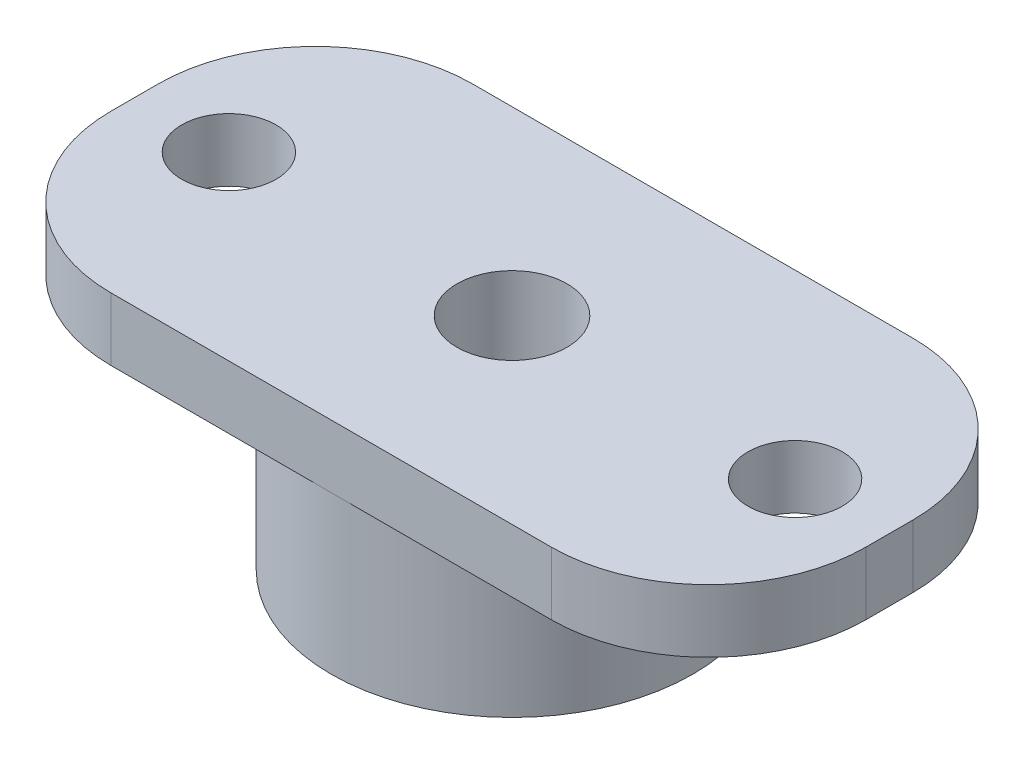
ISO-10303-21;
HEADER;
FILE_DESCRIPTION(('STEP AP214'),'2;1');
FILE_NAME('part.step','',(''),(''),'','','');
FILE_SCHEMA(('AUTOMOTIVE_DESIGN { 1 0 10303 214 1 1 1 1 }'));
ENDSEC;
DATA;
#1=APPLICATION_CONTEXT('core data for automotive mechanical design processes');
#2=APPLICATION_PROTOCOL_DEFINITION('international standard','automotive_design',2000,#1);
#3=PRODUCT_CONTEXT('',#1,'mechanical');
#4=PRODUCT('Part','Part','',(#3));
#5=PRODUCT_RELATED_PRODUCT_CATEGORY('part','',(#4));
#6=PRODUCT_DEFINITION_FORMATION('','',#4);
#7=PRODUCT_DEFINITION_CONTEXT('part definition',#1,'design');
#8=PRODUCT_DEFINITION('design','',#6,#7);
#9=PRODUCT_DEFINITION_SHAPE('','',#8);
#10=(LENGTH_UNIT() NAMED_UNIT(*) SI_UNIT(.MILLI.,.METRE.));
#11=(NAMED_UNIT(*) PLANE_ANGLE_UNIT() SI_UNIT($,.RADIAN.));
#12=(NAMED_UNIT(*) SI_UNIT($,.STERADIAN.) SOLID_ANGLE_UNIT());
#13=UNCERTAINTY_MEASURE_WITH_UNIT(LENGTH_MEASURE(1.E-05),#10,'distance_accuracy_value','');
#14=(GEOMETRIC_REPRESENTATION_CONTEXT(3) GLOBAL_UNCERTAINTY_ASSIGNED_CONTEXT((#13)) GLOBAL_UNIT_ASSIGNED_CONTEXT((#10,
#11,#12)) REPRESENTATION_CONTEXT('',''));
#15=CARTESIAN_POINT('',(0.,0.,0.));
#16=DIRECTION('',(0.,0.,1.));
#17=DIRECTION('',(1.,0.,0.));
#18=AXIS2_PLACEMENT_3D('',#15,#16,#17);
#19=CARTESIAN_POINT('',(0.,7.,0.));
#20=DIRECTION('',(0.,-1.,0.));
#21=DIRECTION('',(0.,0.,-1.));
#22=AXIS2_PLACEMENT_3D('',#19,#20,#21);
#23=CYLINDRICAL_SURFACE('',#22,5.75);
#24=CARTESIAN_POINT('',(0.,0.,0.));
#25=DIRECTION('',(0.,1.,0.));
#26=DIRECTION('',(0.,0.,1.));
#27=AXIS2_PLACEMENT_3D('',#24,#25,#26);
#28=CIRCLE('',#27,5.75);
#29=CARTESIAN_POINT('',(0.,0.,5.75));
#30=VERTEX_POINT('',#29);
#31=EDGE_CURVE('E182',#30,#30,#28,.T.);
#32=ORIENTED_EDGE('',*,*,#31,.T.);
#33=EDGE_LOOP('',(#32));
#34=FACE_BOUND('',#33,.T.);
#35=CARTESIAN_POINT('',(0.,5.,0.));
#36=DIRECTION('',(0.,1.,0.));
#37=DIRECTION('',(0.,0.,1.));
#38=AXIS2_PLACEMENT_3D('',#35,#36,#37);
#39=CIRCLE('',#38,5.75);
#40=CARTESIAN_POINT('',(0.,5.,5.75));
#41=VERTEX_POINT('',#40);
#42=CARTESIAN_POINT('',(0.,5.,-5.75));
#43=VERTEX_POINT('',#42);
#44=EDGE_CURVE('E129',#41,#43,#39,.T.);
#45=ORIENTED_EDGE('',*,*,#44,.F.);
#46=EDGE_CURVE('E136',#43,#41,#39,.T.);
#47=ORIENTED_EDGE('',*,*,#46,.F.);
#48=EDGE_LOOP('',(#45,#47));
#49=FACE_BOUND('',#48,.T.);
#50=ADVANCED_FACE('F56',(#34,#49),#23,.T.);
#51=CARTESIAN_POINT('',(0.,7.,0.));
#52=DIRECTION('',(0.,1.,0.));
#53=DIRECTION('',(0.,0.,1.));
#54=AXIS2_PLACEMENT_3D('',#51,#52,#53);
#55=PLANE('',#54);
#56=CARTESIAN_POINT('',(-9.,7.,0.));
#57=DIRECTION('',(0.,-1.,0.));
#58=DIRECTION('',(0.,0.,-1.));
#59=AXIS2_PLACEMENT_3D('',#56,#57,#58);
#60=CIRCLE('',#59,1.5);
#61=CARTESIAN_POINT('',(-9.,7.,-1.5));
#62=VERTEX_POINT('',#61);
#63=EDGE_CURVE('E164',#62,#62,#60,.T.);
#64=ORIENTED_EDGE('',*,*,#63,.T.);
#65=EDGE_LOOP('',(#64));
#66=FACE_BOUND('',#65,.T.);
#67=CARTESIAN_POINT('',(9.,7.,0.));
#68=DIRECTION('',(0.,-1.,0.));
#69=DIRECTION('',(0.,0.,-1.));
#70=AXIS2_PLACEMENT_3D('',#67,#68,#69);
#71=CIRCLE('',#70,1.5);
#72=CARTESIAN_POINT('',(9.,7.,-1.5));
#73=VERTEX_POINT('',#72);
#74=EDGE_CURVE('E235',#73,#73,#71,.T.);
#75=ORIENTED_EDGE('',*,*,#74,.T.);
#76=EDGE_LOOP('',(#75));
#77=FACE_BOUND('',#76,.T.);
#78=DIRECTION('',(-1.,0.,0.));
#79=VECTOR('',#78,1.);
#80=CARTESIAN_POINT('',(0.,7.,-5.75));
#81=LINE('',#80,#79);
#82=CARTESIAN_POINT('',(7.,7.,-5.75));
#83=VERTEX_POINT('',#82);
#84=CARTESIAN_POINT('',(-7.,7.,-5.75));
#85=VERTEX_POINT('',#84);
#86=EDGE_CURVE('E163',#83,#85,#81,.T.);
#87=ORIENTED_EDGE('',*,*,#86,.T.);
#88=CARTESIAN_POINT('',(-7.,7.,-0.75));
#89=DIRECTION('',(0.,1.,0.));
#90=DIRECTION('',(0.,0.,1.));
#91=AXIS2_PLACEMENT_3D('',#88,#89,#90);
#92=CIRCLE('',#91,5.);
#93=CARTESIAN_POINT('',(-12.,7.,-0.749999999999999));
#94=VERTEX_POINT('',#93);
#95=EDGE_CURVE('E198',#85,#94,#92,.T.);
#96=ORIENTED_EDGE('',*,*,#95,.T.);
#97=DIRECTION('',(0.,0.,-1.));
#98=VECTOR('',#97,1.);
#99=CARTESIAN_POINT('',(-12.,7.,0.));
#100=LINE('',#99,#98);
#101=CARTESIAN_POINT('',(-12.,7.,0.750000000000001));
#102=VERTEX_POINT('',#101);
#103=EDGE_CURVE('E160',#102,#94,#100,.T.);
#104=ORIENTED_EDGE('',*,*,#103,.F.);
#105=CARTESIAN_POINT('',(-7.,7.,0.75));
#106=DIRECTION('',(0.,1.,0.));
#107=DIRECTION('',(0.,0.,1.));
#108=AXIS2_PLACEMENT_3D('',#105,#106,#107);
#109=CIRCLE('',#108,5.);
#110=CARTESIAN_POINT('',(-7.,7.,5.75));
#111=VERTEX_POINT('',#110);
#112=EDGE_CURVE('E196',#102,#111,#109,.T.);
#113=ORIENTED_EDGE('',*,*,#112,.T.);
#114=DIRECTION('',(-1.,0.,0.));
#115=VECTOR('',#114,1.);
#116=CARTESIAN_POINT('',(0.,7.,5.75));
#117=LINE('',#116,#115);
#118=CARTESIAN_POINT('',(7.,7.,5.75));
#119=VERTEX_POINT('',#118);
#120=EDGE_CURVE('E170',#119,#111,#117,.T.);
#121=ORIENTED_EDGE('',*,*,#120,.F.);
#122=CARTESIAN_POINT('',(7.,7.,0.75));
#123=DIRECTION('',(0.,1.,0.));
#124=DIRECTION('',(0.,0.,1.));
#125=AXIS2_PLACEMENT_3D('',#122,#123,#124);
#126=CIRCLE('',#125,5.);
#127=CARTESIAN_POINT('',(12.,7.,0.750000000000001));
#128=VERTEX_POINT('',#127);
#129=EDGE_CURVE('E192',#119,#128,#126,.T.);
#130=ORIENTED_EDGE('',*,*,#129,.T.);
#131=DIRECTION('',(0.,0.,-1.));
#132=VECTOR('',#131,1.);
#133=CARTESIAN_POINT('',(12.,7.,0.));
#134=LINE('',#133,#132);
#135=CARTESIAN_POINT('',(12.,7.,-0.749999999999999));
#136=VERTEX_POINT('',#135);
#137=EDGE_CURVE('E167',#128,#136,#134,.T.);
#138=ORIENTED_EDGE('',*,*,#137,.T.);
#139=CARTESIAN_POINT('',(7.,7.,-0.75));
#140=DIRECTION('',(0.,1.,0.));
#141=DIRECTION('',(0.,0.,1.));
#142=AXIS2_PLACEMENT_3D('',#139,#140,#141);
#143=CIRCLE('',#142,5.);
#144=EDGE_CURVE('E194',#136,#83,#143,.T.);
#145=ORIENTED_EDGE('',*,*,#144,.T.);
#146=EDGE_LOOP('',(#87,#96,#104,#113,#121,#130,#138,#145));
#147=FACE_BOUND('',#146,.T.);
#148=CARTESIAN_POINT('',(0.,7.,0.));
#149=DIRECTION('',(0.,1.,0.));
#150=DIRECTION('',(0.,0.,1.));
#151=AXIS2_PLACEMENT_3D('',#148,#149,#150);
#152=CIRCLE('',#151,1.75);
#153=CARTESIAN_POINT('',(0.,7.,1.75));
#154=VERTEX_POINT('',#153);
#155=EDGE_CURVE('E179',#154,#154,#152,.T.);
#156=ORIENTED_EDGE('',*,*,#155,.F.);
#157=EDGE_LOOP('',(#156));
#158=FACE_BOUND('',#157,.T.);
#159=ADVANCED_FACE('F219',(#66,#77,#147,#158),#55,.T.);
#160=CARTESIAN_POINT('',(0.,0.,0.));
#161=DIRECTION('',(0.,1.,0.));
#162=DIRECTION('',(0.,0.,1.));
#163=AXIS2_PLACEMENT_3D('',#160,#161,#162);
#164=PLANE('',#163);
#165=CARTESIAN_POINT('',(0.,0.,0.));
#166=DIRECTION('',(0.,1.,0.));
#167=DIRECTION('',(0.,0.,1.));
#168=AXIS2_PLACEMENT_3D('',#165,#166,#167);
#169=CIRCLE('',#168,3.1);
#170=CARTESIAN_POINT('',(0.,0.,3.1));
#171=VERTEX_POINT('',#170);
#172=EDGE_CURVE('E142',#171,#171,#169,.T.);
#173=ORIENTED_EDGE('',*,*,#172,.T.);
#174=EDGE_LOOP('',(#173));
#175=FACE_BOUND('',#174,.T.);
#176=ORIENTED_EDGE('',*,*,#31,.F.);
#177=EDGE_LOOP('',(#176));
#178=FACE_BOUND('',#177,.T.);
#179=ADVANCED_FACE('F255',(#175,#178),#164,.F.);
#180=CARTESIAN_POINT('',(0.,7.,0.));
#181=DIRECTION('',(0.,-1.,0.));
#182=DIRECTION('',(0.,0.,-1.));
#183=AXIS2_PLACEMENT_3D('',#180,#181,#182);
#184=CYLINDRICAL_SURFACE('',#183,1.75);
#185=ORIENTED_EDGE('',*,*,#155,.T.);
#186=EDGE_LOOP('',(#185));
#187=FACE_BOUND('',#186,.T.);
#188=CARTESIAN_POINT('',(0.,2.6,0.));
#189=DIRECTION('',(0.,1.,0.));
#190=DIRECTION('',(0.,0.,1.));
#191=AXIS2_PLACEMENT_3D('',#188,#189,#190);
#192=CIRCLE('',#191,1.75);
#193=CARTESIAN_POINT('',(0.,2.6,1.75));
#194=VERTEX_POINT('',#193);
#195=EDGE_CURVE('E176',#194,#194,#192,.T.);
#196=ORIENTED_EDGE('',*,*,#195,.F.);
#197=EDGE_LOOP('',(#196));
#198=FACE_BOUND('',#197,.T.);
#199=ADVANCED_FACE('F295',(#187,#198),#184,.F.);
#200=CARTESIAN_POINT('',(0.,2.6,0.));
#201=DIRECTION('',(0.,-1.,0.));
#202=DIRECTION('',(0.,0.,-1.));
#203=AXIS2_PLACEMENT_3D('',#200,#201,#202);
#204=CYLINDRICAL_SURFACE('',#203,3.1);
#205=CARTESIAN_POINT('',(0.,2.6,0.));
#206=DIRECTION('',(0.,1.,0.));
#207=DIRECTION('',(0.,0.,1.));
#208=AXIS2_PLACEMENT_3D('',#205,#206,#207);
#209=CIRCLE('',#208,3.1);
#210=CARTESIAN_POINT('',(0.,2.6,3.1));
#211=VERTEX_POINT('',#210);
#212=EDGE_CURVE('E173',#211,#211,#209,.T.);
#213=ORIENTED_EDGE('',*,*,#212,.T.);
#214=EDGE_LOOP('',(#213));
#215=FACE_BOUND('',#214,.T.);
#216=ORIENTED_EDGE('',*,*,#172,.F.);
#217=EDGE_LOOP('',(#216));
#218=FACE_BOUND('',#217,.T.);
#219=ADVANCED_FACE('F291',(#215,#218),#204,.F.);
#220=CARTESIAN_POINT('',(0.,2.6,0.));
#221=DIRECTION('',(0.,1.,0.));
#222=DIRECTION('',(0.,0.,1.));
#223=AXIS2_PLACEMENT_3D('',#220,#221,#222);
#224=PLANE('',#223);
#225=ORIENTED_EDGE('',*,*,#195,.T.);
#226=EDGE_LOOP('',(#225));
#227=FACE_BOUND('',#226,.T.);
#228=ORIENTED_EDGE('',*,*,#212,.F.);
#229=EDGE_LOOP('',(#228));
#230=FACE_BOUND('',#229,.T.);
#231=ADVANCED_FACE('F286',(#227,#230),#224,.F.);
#232=CARTESIAN_POINT('',(0.,5.,-5.75));
#233=DIRECTION('',(0.,0.,-1.));
#234=DIRECTION('',(-1.,0.,0.));
#235=AXIS2_PLACEMENT_3D('',#232,#233,#234);
#236=PLANE('',#235);
#237=DIRECTION('',(-1.,0.,0.));
#238=VECTOR('',#237,1.);
#239=CARTESIAN_POINT('',(0.,5.,-5.75));
#240=LINE('',#239,#238);
#241=CARTESIAN_POINT('',(-7.,5.,-5.75));
#242=VERTEX_POINT('',#241);
#243=EDGE_CURVE('E150',#43,#242,#240,.T.);
#244=ORIENTED_EDGE('',*,*,#243,.T.);
#245=DIRECTION('',(0.,1.,0.));
#246=VECTOR('',#245,1.);
#247=CARTESIAN_POINT('',(-7.,7.,-5.75));
#248=LINE('',#247,#246);
#249=EDGE_CURVE('E189',#242,#85,#248,.T.);
#250=ORIENTED_EDGE('',*,*,#249,.T.);
#251=ORIENTED_EDGE('',*,*,#86,.F.);
#252=DIRECTION('',(0.,1.,0.));
#253=VECTOR('',#252,1.);
#254=CARTESIAN_POINT('',(7.,5.,-5.75));
#255=LINE('',#254,#253);
#256=CARTESIAN_POINT('',(7.,5.,-5.75));
#257=VERTEX_POINT('',#256);
#258=EDGE_CURVE('E185',#83,#257,#255,.F.);
#259=ORIENTED_EDGE('',*,*,#258,.T.);
#260=EDGE_CURVE('E156',#257,#43,#240,.T.);
#261=ORIENTED_EDGE('',*,*,#260,.T.);
#262=EDGE_LOOP('',(#244,#250,#251,#259,#261));
#263=FACE_BOUND('',#262,.T.);
#264=ADVANCED_FACE('F238',(#263),#236,.T.);
#265=CARTESIAN_POINT('',(0.,5.,5.75));
#266=DIRECTION('',(0.,0.,-1.));
#267=DIRECTION('',(-1.,0.,0.));
#268=AXIS2_PLACEMENT_3D('',#265,#266,#267);
#269=PLANE('',#268);
#270=ORIENTED_EDGE('',*,*,#120,.T.);
#271=DIRECTION('',(0.,1.,0.));
#272=VECTOR('',#271,1.);
#273=CARTESIAN_POINT('',(-7.,5.,5.75));
#274=LINE('',#273,#272);
#275=CARTESIAN_POINT('',(-7.,5.,5.75));
#276=VERTEX_POINT('',#275);
#277=EDGE_CURVE('E154',#111,#276,#274,.F.);
#278=ORIENTED_EDGE('',*,*,#277,.T.);
#279=DIRECTION('',(-1.,0.,0.));
#280=VECTOR('',#279,1.);
#281=CARTESIAN_POINT('',(0.,5.,5.75));
#282=LINE('',#281,#280);
#283=EDGE_CURVE('E137',#41,#276,#282,.T.);
#284=ORIENTED_EDGE('',*,*,#283,.F.);
#285=CARTESIAN_POINT('',(7.,5.,5.75));
#286=VERTEX_POINT('',#285);
#287=EDGE_CURVE('E126',#286,#41,#282,.T.);
#288=ORIENTED_EDGE('',*,*,#287,.F.);
#289=DIRECTION('',(0.,1.,0.));
#290=VECTOR('',#289,1.);
#291=CARTESIAN_POINT('',(7.,7.,5.75));
#292=LINE('',#291,#290);
#293=EDGE_CURVE('E209',#286,#119,#292,.T.);
#294=ORIENTED_EDGE('',*,*,#293,.T.);
#295=EDGE_LOOP('',(#270,#278,#284,#288,#294));
#296=FACE_BOUND('',#295,.T.);
#297=ADVANCED_FACE('F152',(#296),#269,.F.);
#298=CARTESIAN_POINT('',(0.,5.,0.));
#299=DIRECTION('',(0.,1.,0.));
#300=DIRECTION('',(0.,0.,1.));
#301=AXIS2_PLACEMENT_3D('',#298,#299,#300);
#302=PLANE('',#301);
#303=CARTESIAN_POINT('',(9.,5.,0.));
#304=DIRECTION('',(0.,-1.,0.));
#305=DIRECTION('',(0.,0.,-1.));
#306=AXIS2_PLACEMENT_3D('',#303,#304,#305);
#307=CIRCLE('',#306,1.5);
#308=CARTESIAN_POINT('',(9.,5.,-1.5));
#309=VERTEX_POINT('',#308);
#310=EDGE_CURVE('E419',#309,#309,#307,.T.);
#311=ORIENTED_EDGE('',*,*,#310,.F.);
#312=EDGE_LOOP('',(#311));
#313=FACE_BOUND('',#312,.T.);
#314=ORIENTED_EDGE('',*,*,#260,.F.);
#315=CARTESIAN_POINT('',(7.,5.,-0.75));
#316=DIRECTION('',(0.,1.,0.));
#317=DIRECTION('',(0.,0.,1.));
#318=AXIS2_PLACEMENT_3D('',#315,#316,#317);
#319=CIRCLE('',#318,5.);
#320=CARTESIAN_POINT('',(12.,5.,-0.749999999999999));
#321=VERTEX_POINT('',#320);
#322=EDGE_CURVE('E12',#257,#321,#319,.F.);
#323=ORIENTED_EDGE('',*,*,#322,.T.);
#324=DIRECTION('',(0.,0.,-1.));
#325=VECTOR('',#324,1.);
#326=CARTESIAN_POINT('',(12.,5.,0.));
#327=LINE('',#326,#325);
#328=CARTESIAN_POINT('',(12.,5.,0.750000000000001));
#329=VERTEX_POINT('',#328);
#330=EDGE_CURVE('E155',#329,#321,#327,.T.);
#331=ORIENTED_EDGE('',*,*,#330,.F.);
#332=CARTESIAN_POINT('',(7.,5.,0.75));
#333=DIRECTION('',(0.,1.,0.));
#334=DIRECTION('',(0.,0.,1.));
#335=AXIS2_PLACEMENT_3D('',#332,#333,#334);
#336=CIRCLE('',#335,5.);
#337=EDGE_CURVE('E64',#329,#286,#336,.F.);
#338=ORIENTED_EDGE('',*,*,#337,.T.);
#339=ORIENTED_EDGE('',*,*,#287,.T.);
#340=ORIENTED_EDGE('',*,*,#44,.T.);
#341=EDGE_LOOP('',(#314,#323,#331,#338,#339,#340));
#342=FACE_BOUND('',#341,.T.);
#343=ADVANCED_FACE('F128',(#313,#342),#302,.F.);
#344=CARTESIAN_POINT('',(-9.,5.,0.));
#345=DIRECTION('',(0.,-1.,0.));
#346=DIRECTION('',(0.,0.,-1.));
#347=AXIS2_PLACEMENT_3D('',#344,#345,#346);
#348=CIRCLE('',#347,1.5);
#349=CARTESIAN_POINT('',(-9.,5.,-1.5));
#350=VERTEX_POINT('',#349);
#351=EDGE_CURVE('E417',#350,#350,#348,.T.);
#352=ORIENTED_EDGE('',*,*,#351,.F.);
#353=EDGE_LOOP('',(#352));
#354=FACE_BOUND('',#353,.T.);
#355=DIRECTION('',(0.,0.,-1.));
#356=VECTOR('',#355,1.);
#357=CARTESIAN_POINT('',(-12.,5.,0.));
#358=LINE('',#357,#356);
#359=CARTESIAN_POINT('',(-12.,5.,0.750000000000001));
#360=VERTEX_POINT('',#359);
#361=CARTESIAN_POINT('',(-12.,5.,-0.749999999999999));
#362=VERTEX_POINT('',#361);
#363=EDGE_CURVE('E171',#360,#362,#358,.T.);
#364=ORIENTED_EDGE('',*,*,#363,.T.);
#365=CARTESIAN_POINT('',(-7.,5.,-0.75));
#366=DIRECTION('',(0.,1.,0.));
#367=DIRECTION('',(0.,0.,1.));
#368=AXIS2_PLACEMENT_3D('',#365,#366,#367);
#369=CIRCLE('',#368,5.);
#370=EDGE_CURVE('E207',#362,#242,#369,.F.);
#371=ORIENTED_EDGE('',*,*,#370,.T.);
#372=ORIENTED_EDGE('',*,*,#243,.F.);
#373=ORIENTED_EDGE('',*,*,#46,.T.);
#374=ORIENTED_EDGE('',*,*,#283,.T.);
#375=CARTESIAN_POINT('',(-7.,5.,0.75));
#376=DIRECTION('',(0.,1.,0.));
#377=DIRECTION('',(0.,0.,1.));
#378=AXIS2_PLACEMENT_3D('',#375,#376,#377);
#379=CIRCLE('',#378,5.);
#380=EDGE_CURVE('E205',#276,#360,#379,.F.);
#381=ORIENTED_EDGE('',*,*,#380,.T.);
#382=EDGE_LOOP('',(#364,#371,#372,#373,#374,#381));
#383=FACE_BOUND('',#382,.T.);
#384=ADVANCED_FACE('F147',(#354,#383),#302,.F.);
#385=CARTESIAN_POINT('',(-12.,5.,0.));
#386=DIRECTION('',(1.,0.,0.));
#387=DIRECTION('',(0.,0.,-1.));
#388=AXIS2_PLACEMENT_3D('',#385,#386,#387);
#389=PLANE('',#388);
#390=ORIENTED_EDGE('',*,*,#103,.T.);
#391=DIRECTION('',(0.,1.,0.));
#392=VECTOR('',#391,1.);
#393=CARTESIAN_POINT('',(-12.,5.,-0.749999999999999));
#394=LINE('',#393,#392);
#395=EDGE_CURVE('E203',#94,#362,#394,.F.);
#396=ORIENTED_EDGE('',*,*,#395,.T.);
#397=ORIENTED_EDGE('',*,*,#363,.F.);
#398=DIRECTION('',(0.,1.,0.));
#399=VECTOR('',#398,1.);
#400=CARTESIAN_POINT('',(-12.,5.,0.750000000000001));
#401=LINE('',#400,#399);
#402=EDGE_CURVE('E200',#360,#102,#401,.T.);
#403=ORIENTED_EDGE('',*,*,#402,.T.);
#404=EDGE_LOOP('',(#390,#396,#397,#403));
#405=FACE_BOUND('',#404,.T.);
#406=ADVANCED_FACE('F230',(#405),#389,.F.);
#407=CARTESIAN_POINT('',(12.,5.,0.));
#408=DIRECTION('',(1.,0.,0.));
#409=DIRECTION('',(0.,0.,-1.));
#410=AXIS2_PLACEMENT_3D('',#407,#408,#409);
#411=PLANE('',#410);
#412=ORIENTED_EDGE('',*,*,#330,.T.);
#413=DIRECTION('',(0.,1.,0.));
#414=VECTOR('',#413,1.);
#415=CARTESIAN_POINT('',(12.,5.,-0.749999999999999));
#416=LINE('',#415,#414);
#417=EDGE_CURVE('E213',#321,#136,#416,.T.);
#418=ORIENTED_EDGE('',*,*,#417,.T.);
#419=ORIENTED_EDGE('',*,*,#137,.F.);
#420=DIRECTION('',(0.,1.,0.));
#421=VECTOR('',#420,1.);
#422=CARTESIAN_POINT('',(12.,5.,0.750000000000001));
#423=LINE('',#422,#421);
#424=EDGE_CURVE('E76',#128,#329,#423,.F.);
#425=ORIENTED_EDGE('',*,*,#424,.T.);
#426=EDGE_LOOP('',(#412,#418,#419,#425));
#427=FACE_BOUND('',#426,.T.);
#428=ADVANCED_FACE('F216',(#427),#411,.T.);
#429=CARTESIAN_POINT('',(-9.,7.,0.));
#430=DIRECTION('',(0.,-1.,0.));
#431=DIRECTION('',(0.,0.,-1.));
#432=AXIS2_PLACEMENT_3D('',#429,#430,#431);
#433=CYLINDRICAL_SURFACE('',#432,1.5);
#434=ORIENTED_EDGE('',*,*,#63,.F.);
#435=EDGE_LOOP('',(#434));
#436=FACE_BOUND('',#435,.T.);
#437=ORIENTED_EDGE('',*,*,#351,.T.);
#438=EDGE_LOOP('',(#437));
#439=FACE_BOUND('',#438,.T.);
#440=ADVANCED_FACE('F266',(#436,#439),#433,.F.);
#441=CARTESIAN_POINT('',(9.,7.,0.));
#442=DIRECTION('',(0.,-1.,0.));
#443=DIRECTION('',(0.,0.,-1.));
#444=AXIS2_PLACEMENT_3D('',#441,#442,#443);
#445=CYLINDRICAL_SURFACE('',#444,1.5);
#446=ORIENTED_EDGE('',*,*,#74,.F.);
#447=EDGE_LOOP('',(#446));
#448=FACE_BOUND('',#447,.T.);
#449=ORIENTED_EDGE('',*,*,#310,.T.);
#450=EDGE_LOOP('',(#449));
#451=FACE_BOUND('',#450,.T.);
#452=ADVANCED_FACE('F261',(#448,#451),#445,.F.);
#453=CARTESIAN_POINT('',(-7.,5.,-0.75));
#454=DIRECTION('',(0.,-1.,0.));
#455=DIRECTION('',(0.,0.,-1.));
#456=AXIS2_PLACEMENT_3D('',#453,#454,#455);
#457=CYLINDRICAL_SURFACE('',#456,5.);
#458=ORIENTED_EDGE('',*,*,#370,.F.);
#459=ORIENTED_EDGE('',*,*,#395,.F.);
#460=ORIENTED_EDGE('',*,*,#95,.F.);
#461=ORIENTED_EDGE('',*,*,#249,.F.);
#462=EDGE_LOOP('',(#458,#459,#460,#461));
#463=FACE_BOUND('',#462,.T.);
#464=ADVANCED_FACE('F247',(#463),#457,.T.);
#465=CARTESIAN_POINT('',(-7.,5.,0.75));
#466=DIRECTION('',(0.,1.,0.));
#467=DIRECTION('',(0.,0.,1.));
#468=AXIS2_PLACEMENT_3D('',#465,#466,#467);
#469=CYLINDRICAL_SURFACE('',#468,5.);
#470=ORIENTED_EDGE('',*,*,#380,.F.);
#471=ORIENTED_EDGE('',*,*,#277,.F.);
#472=ORIENTED_EDGE('',*,*,#112,.F.);
#473=ORIENTED_EDGE('',*,*,#402,.F.);
#474=EDGE_LOOP('',(#470,#471,#472,#473));
#475=FACE_BOUND('',#474,.T.);
#476=ADVANCED_FACE('F225',(#475),#469,.T.);
#477=CARTESIAN_POINT('',(7.,5.,-0.75));
#478=DIRECTION('',(0.,1.,0.));
#479=DIRECTION('',(0.,0.,1.));
#480=AXIS2_PLACEMENT_3D('',#477,#478,#479);
#481=CYLINDRICAL_SURFACE('',#480,5.);
#482=ORIENTED_EDGE('',*,*,#322,.F.);
#483=ORIENTED_EDGE('',*,*,#258,.F.);
#484=ORIENTED_EDGE('',*,*,#144,.F.);
#485=ORIENTED_EDGE('',*,*,#417,.F.);
#486=EDGE_LOOP('',(#482,#483,#484,#485));
#487=FACE_BOUND('',#486,.T.);
#488=ADVANCED_FACE('F241',(#487),#481,.T.);
#489=CARTESIAN_POINT('',(7.,5.,0.75));
#490=DIRECTION('',(0.,-1.,0.));
#491=DIRECTION('',(0.,0.,-1.));
#492=AXIS2_PLACEMENT_3D('',#489,#490,#491);
#493=CYLINDRICAL_SURFACE('',#492,5.);
#494=ORIENTED_EDGE('',*,*,#337,.F.);
#495=ORIENTED_EDGE('',*,*,#424,.F.);
#496=ORIENTED_EDGE('',*,*,#129,.F.);
#497=ORIENTED_EDGE('',*,*,#293,.F.);
#498=EDGE_LOOP('',(#494,#495,#496,#497));
#499=FACE_BOUND('',#498,.T.);
#500=ADVANCED_FACE('F58',(#499),#493,.T.);
#501=CLOSED_SHELL('',(#50,#159,#179,#199,#219,#231,#264,#297,#343,#384,#406,#428,#440,#452,#464,
#476,#488,#500));
#502=MANIFOLD_SOLID_BREP('B2',#501);
#503=ADVANCED_BREP_SHAPE_REPRESENTATION('',(#18,#502),#14);
#504=SHAPE_DEFINITION_REPRESENTATION(#9,#503);
ENDSEC;
END-ISO-10303-21;
